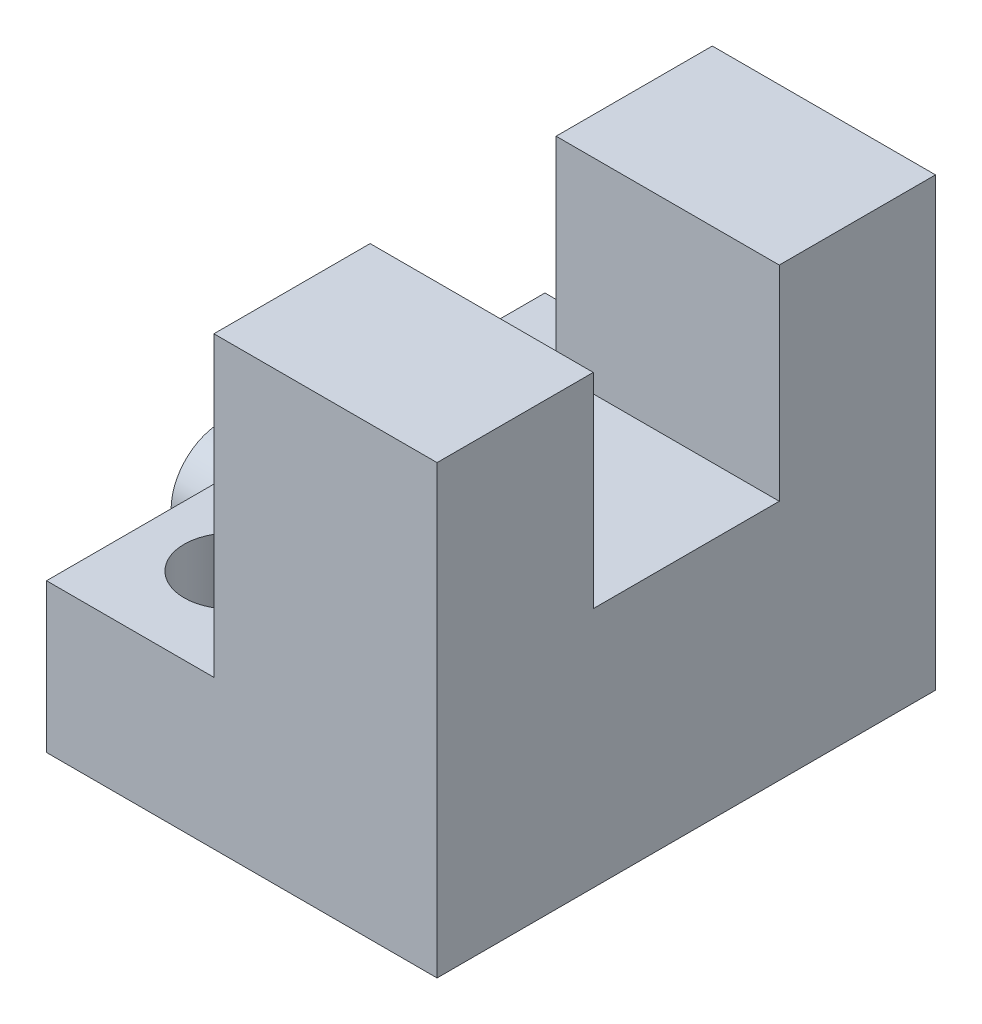
ISO-10303-21;
HEADER;
FILE_DESCRIPTION(('STEP AP214'),'2;1');
FILE_NAME('part.step','',(''),(''),'','','');
FILE_SCHEMA(('AUTOMOTIVE_DESIGN { 1 0 10303 214 1 1 1 1 }'));
ENDSEC;
DATA;
#1=APPLICATION_CONTEXT('core data for automotive mechanical design processes');
#2=APPLICATION_PROTOCOL_DEFINITION('international standard','automotive_design',2000,#1);
#3=PRODUCT_CONTEXT('',#1,'mechanical');
#4=PRODUCT('Part','Part','',(#3));
#5=PRODUCT_RELATED_PRODUCT_CATEGORY('part','',(#4));
#6=PRODUCT_DEFINITION_FORMATION('','',#4);
#7=PRODUCT_DEFINITION_CONTEXT('part definition',#1,'design');
#8=PRODUCT_DEFINITION('design','',#6,#7);
#9=PRODUCT_DEFINITION_SHAPE('','',#8);
#10=(LENGTH_UNIT() NAMED_UNIT(*) SI_UNIT(.MILLI.,.METRE.));
#11=(NAMED_UNIT(*) PLANE_ANGLE_UNIT() SI_UNIT($,.RADIAN.));
#12=(NAMED_UNIT(*) SI_UNIT($,.STERADIAN.) SOLID_ANGLE_UNIT());
#13=UNCERTAINTY_MEASURE_WITH_UNIT(LENGTH_MEASURE(1.E-05),#10,'distance_accuracy_value','');
#14=(GEOMETRIC_REPRESENTATION_CONTEXT(3) GLOBAL_UNCERTAINTY_ASSIGNED_CONTEXT((#13)) GLOBAL_UNIT_ASSIGNED_CONTEXT((#10,
#11,#12)) REPRESENTATION_CONTEXT('',''));
#15=CARTESIAN_POINT('',(0.,0.,0.));
#16=DIRECTION('',(0.,0.,1.));
#17=DIRECTION('',(1.,0.,0.));
#18=AXIS2_PLACEMENT_3D('',#15,#16,#17);
#19=CARTESIAN_POINT('',(4.5,12.,6.7));
#20=DIRECTION('',(0.,-1.,0.));
#21=DIRECTION('',(0.,0.,-1.));
#22=AXIS2_PLACEMENT_3D('',#19,#20,#21);
#23=PLANE('',#22);
#24=DIRECTION('',(0.,0.,-1.));
#25=VECTOR('',#24,1.);
#26=CARTESIAN_POINT('',(4.5,12.,6.7));
#27=LINE('',#26,#25);
#28=CARTESIAN_POINT('',(4.5,12.,-2.5));
#29=VERTEX_POINT('',#28);
#30=CARTESIAN_POINT('',(4.5,12.,-6.7));
#31=VERTEX_POINT('',#30);
#32=EDGE_CURVE('P0_E212',#29,#31,#27,.T.);
#33=ORIENTED_EDGE('',*,*,#32,.F.);
#34=DIRECTION('',(-1.,0.,0.));
#35=VECTOR('',#34,1.);
#36=CARTESIAN_POINT('',(10.5,12.,-2.5));
#37=LINE('',#36,#35);
#38=CARTESIAN_POINT('',(10.5,12.,-2.5));
#39=VERTEX_POINT('',#38);
#40=EDGE_CURVE('P0_E164',#39,#29,#37,.T.);
#41=ORIENTED_EDGE('',*,*,#40,.F.);
#42=DIRECTION('',(0.,0.,-1.));
#43=VECTOR('',#42,1.);
#44=CARTESIAN_POINT('',(10.5,12.,6.7));
#45=LINE('',#44,#43);
#46=CARTESIAN_POINT('',(10.5,12.,-6.7));
#47=VERTEX_POINT('',#46);
#48=EDGE_CURVE('P0_E216',#39,#47,#45,.T.);
#49=ORIENTED_EDGE('',*,*,#48,.T.);
#50=DIRECTION('',(-1.,0.,0.));
#51=VECTOR('',#50,1.);
#52=CARTESIAN_POINT('',(4.5,12.,-6.7));
#53=LINE('',#52,#51);
#54=EDGE_CURVE('P0_E196',#47,#31,#53,.T.);
#55=ORIENTED_EDGE('',*,*,#54,.T.);
#56=EDGE_LOOP('',(#33,#41,#49,#55));
#57=FACE_BOUND('',#56,.T.);
#58=ADVANCED_FACE('P0_F17',(#57),#23,.F.);
#59=CARTESIAN_POINT('',(0.,0.,6.7));
#60=DIRECTION('',(1.,0.,0.));
#61=DIRECTION('',(0.,0.,-1.));
#62=AXIS2_PLACEMENT_3D('',#59,#60,#61);
#63=PLANE('',#62);
#64=DIRECTION('',(0.,-1.,0.));
#65=VECTOR('',#64,1.);
#66=CARTESIAN_POINT('',(0.,0.,-6.7));
#67=LINE('',#66,#65);
#68=CARTESIAN_POINT('',(0.,4.,-6.7));
#69=VERTEX_POINT('',#68);
#70=CARTESIAN_POINT('',(0.,0.,-6.7));
#71=VERTEX_POINT('',#70);
#72=EDGE_CURVE('P0_E180',#69,#71,#67,.T.);
#73=ORIENTED_EDGE('',*,*,#72,.T.);
#74=DIRECTION('',(0.,0.,-1.));
#75=VECTOR('',#74,1.);
#76=CARTESIAN_POINT('',(0.,0.,6.7));
#77=LINE('',#76,#75);
#78=CARTESIAN_POINT('',(0.,0.,6.7));
#79=VERTEX_POINT('',#78);
#80=EDGE_CURVE('P0_E190',#79,#71,#77,.T.);
#81=ORIENTED_EDGE('',*,*,#80,.F.);
#82=DIRECTION('',(0.,-1.,0.));
#83=VECTOR('',#82,1.);
#84=CARTESIAN_POINT('',(0.,0.,6.7));
#85=LINE('',#84,#83);
#86=CARTESIAN_POINT('',(0.,4.,6.7));
#87=VERTEX_POINT('',#86);
#88=EDGE_CURVE('P0_E188',#87,#79,#85,.T.);
#89=ORIENTED_EDGE('',*,*,#88,.F.);
#90=DIRECTION('',(0.,0.,-1.));
#91=VECTOR('',#90,1.);
#92=CARTESIAN_POINT('',(0.,4.,6.7));
#93=LINE('',#92,#91);
#94=EDGE_CURVE('P0_E206',#87,#69,#93,.T.);
#95=ORIENTED_EDGE('',*,*,#94,.T.);
#96=EDGE_LOOP('',(#73,#81,#89,#95));
#97=FACE_BOUND('',#96,.T.);
#98=CARTESIAN_POINT('',(0.,2.,0.));
#99=DIRECTION('',(1.,0.,0.));
#100=DIRECTION('',(0.,0.,-1.));
#101=AXIS2_PLACEMENT_3D('',#98,#99,#100);
#102=CIRCLE('',#101,1.35);
#103=CARTESIAN_POINT('',(0.,2.,-1.35));
#104=VERTEX_POINT('',#103);
#105=EDGE_CURVE('P0_E11',#104,#104,#102,.F.);
#106=ORIENTED_EDGE('',*,*,#105,.F.);
#107=EDGE_LOOP('',(#106));
#108=FACE_BOUND('',#107,.T.);
#109=ADVANCED_FACE('P0_F255',(#97,#108),#63,.F.);
#110=CARTESIAN_POINT('',(10.5,0.,6.7));
#111=DIRECTION('',(0.,1.,0.));
#112=DIRECTION('',(0.,0.,1.));
#113=AXIS2_PLACEMENT_3D('',#110,#111,#112);
#114=PLANE('',#113);
#115=CARTESIAN_POINT('',(2.25,0.,4.));
#116=DIRECTION('',(0.,1.,0.));
#117=DIRECTION('',(0.,0.,1.));
#118=AXIS2_PLACEMENT_3D('',#115,#116,#117);
#119=CIRCLE('',#118,1.25);
#120=CARTESIAN_POINT('',(2.25,0.,5.25));
#121=VERTEX_POINT('',#120);
#122=EDGE_CURVE('P0_E141',#121,#121,#119,.T.);
#123=ORIENTED_EDGE('',*,*,#122,.T.);
#124=EDGE_LOOP('',(#123));
#125=FACE_BOUND('',#124,.T.);
#126=CARTESIAN_POINT('',(2.25,0.,-4.));
#127=DIRECTION('',(0.,1.,0.));
#128=DIRECTION('',(0.,0.,1.));
#129=AXIS2_PLACEMENT_3D('',#126,#127,#128);
#130=CIRCLE('',#129,1.25);
#131=CARTESIAN_POINT('',(2.25,0.,-2.75));
#132=VERTEX_POINT('',#131);
#133=EDGE_CURVE('P0_E147',#132,#132,#130,.T.);
#134=ORIENTED_EDGE('',*,*,#133,.T.);
#135=EDGE_LOOP('',(#134));
#136=FACE_BOUND('',#135,.T.);
#137=DIRECTION('',(1.,0.,0.));
#138=VECTOR('',#137,1.);
#139=CARTESIAN_POINT('',(10.5,0.,-6.7));
#140=LINE('',#139,#138);
#141=CARTESIAN_POINT('',(10.5,0.,-6.7));
#142=VERTEX_POINT('',#141);
#143=EDGE_CURVE('P0_E175',#71,#142,#140,.T.);
#144=ORIENTED_EDGE('',*,*,#143,.T.);
#145=DIRECTION('',(0.,0.,-1.));
#146=VECTOR('',#145,1.);
#147=CARTESIAN_POINT('',(10.5,0.,6.7));
#148=LINE('',#147,#146);
#149=CARTESIAN_POINT('',(10.5,0.,6.7));
#150=VERTEX_POINT('',#149);
#151=EDGE_CURVE('P0_E25',#150,#142,#148,.T.);
#152=ORIENTED_EDGE('',*,*,#151,.F.);
#153=DIRECTION('',(1.,0.,0.));
#154=VECTOR('',#153,1.);
#155=CARTESIAN_POINT('',(10.5,0.,6.7));
#156=LINE('',#155,#154);
#157=EDGE_CURVE('P0_E176',#79,#150,#156,.T.);
#158=ORIENTED_EDGE('',*,*,#157,.F.);
#159=ORIENTED_EDGE('',*,*,#80,.T.);
#160=EDGE_LOOP('',(#144,#152,#158,#159));
#161=FACE_BOUND('',#160,.T.);
#162=ADVANCED_FACE('P0_F19',(#125,#136,#161),#114,.F.);
#163=CARTESIAN_POINT('',(10.5,12.,6.7));
#164=DIRECTION('',(-1.,0.,0.));
#165=DIRECTION('',(0.,0.,1.));
#166=AXIS2_PLACEMENT_3D('',#163,#164,#165);
#167=PLANE('',#166);
#168=ORIENTED_EDGE('',*,*,#48,.F.);
#169=DIRECTION('',(0.,-1.,0.));
#170=VECTOR('',#169,1.);
#171=CARTESIAN_POINT('',(10.5,12.,-2.5));
#172=LINE('',#171,#170);
#173=CARTESIAN_POINT('',(10.5,6.5,-2.5));
#174=VERTEX_POINT('',#173);
#175=EDGE_CURVE('P0_E150',#39,#174,#172,.T.);
#176=ORIENTED_EDGE('',*,*,#175,.T.);
#177=DIRECTION('',(0.,0.,1.));
#178=VECTOR('',#177,1.);
#179=CARTESIAN_POINT('',(10.5,6.5,-2.5));
#180=LINE('',#179,#178);
#181=CARTESIAN_POINT('',(10.5,6.5,2.5));
#182=VERTEX_POINT('',#181);
#183=EDGE_CURVE('P0_E153',#174,#182,#180,.T.);
#184=ORIENTED_EDGE('',*,*,#183,.T.);
#185=DIRECTION('',(0.,1.,0.));
#186=VECTOR('',#185,1.);
#187=CARTESIAN_POINT('',(10.5,12.,2.5));
#188=LINE('',#187,#186);
#189=CARTESIAN_POINT('',(10.5,12.,2.5));
#190=VERTEX_POINT('',#189);
#191=EDGE_CURVE('P0_E157',#182,#190,#188,.T.);
#192=ORIENTED_EDGE('',*,*,#191,.T.);
#193=CARTESIAN_POINT('',(10.5,12.,6.7));
#194=VERTEX_POINT('',#193);
#195=EDGE_CURVE('P0_E217',#194,#190,#45,.T.);
#196=ORIENTED_EDGE('',*,*,#195,.F.);
#197=DIRECTION('',(0.,1.,0.));
#198=VECTOR('',#197,1.);
#199=CARTESIAN_POINT('',(10.5,12.,6.7));
#200=LINE('',#199,#198);
#201=EDGE_CURVE('P0_E179',#150,#194,#200,.T.);
#202=ORIENTED_EDGE('',*,*,#201,.F.);
#203=ORIENTED_EDGE('',*,*,#151,.T.);
#204=DIRECTION('',(0.,1.,0.));
#205=VECTOR('',#204,1.);
#206=CARTESIAN_POINT('',(10.5,12.,-6.7));
#207=LINE('',#206,#205);
#208=EDGE_CURVE('P0_E193',#142,#47,#207,.T.);
#209=ORIENTED_EDGE('',*,*,#208,.T.);
#210=EDGE_LOOP('',(#168,#176,#184,#192,#196,#202,#203,#209));
#211=FACE_BOUND('',#210,.T.);
#212=ADVANCED_FACE('P0_F223',(#211),#167,.F.);
#213=ORIENTED_EDGE('',*,*,#195,.T.);
#214=DIRECTION('',(-1.,0.,0.));
#215=VECTOR('',#214,1.);
#216=CARTESIAN_POINT('',(10.5,12.,2.5));
#217=LINE('',#216,#215);
#218=CARTESIAN_POINT('',(4.5,12.,2.5));
#219=VERTEX_POINT('',#218);
#220=EDGE_CURVE('P0_E167',#190,#219,#217,.T.);
#221=ORIENTED_EDGE('',*,*,#220,.T.);
#222=CARTESIAN_POINT('',(4.5,12.,6.7));
#223=VERTEX_POINT('',#222);
#224=EDGE_CURVE('P0_E213',#223,#219,#27,.T.);
#225=ORIENTED_EDGE('',*,*,#224,.F.);
#226=DIRECTION('',(-1.,0.,0.));
#227=VECTOR('',#226,1.);
#228=CARTESIAN_POINT('',(4.5,12.,6.7));
#229=LINE('',#228,#227);
#230=EDGE_CURVE('P0_E182',#194,#223,#229,.T.);
#231=ORIENTED_EDGE('',*,*,#230,.F.);
#232=EDGE_LOOP('',(#213,#221,#225,#231));
#233=FACE_BOUND('',#232,.T.);
#234=ADVANCED_FACE('P0_F245',(#233),#23,.F.);
#235=CARTESIAN_POINT('',(4.5,4.,6.7));
#236=DIRECTION('',(1.,0.,0.));
#237=DIRECTION('',(0.,0.,-1.));
#238=AXIS2_PLACEMENT_3D('',#235,#236,#237);
#239=PLANE('',#238);
#240=DIRECTION('',(0.,1.,0.));
#241=VECTOR('',#240,1.);
#242=CARTESIAN_POINT('',(4.5,12.,2.5));
#243=LINE('',#242,#241);
#244=CARTESIAN_POINT('',(4.5,5.5,2.5));
#245=VERTEX_POINT('',#244);
#246=EDGE_CURVE('P0_E154',#245,#219,#243,.T.);
#247=ORIENTED_EDGE('',*,*,#246,.F.);
#248=DIRECTION('',(0.,0.,1.));
#249=VECTOR('',#248,1.);
#250=CARTESIAN_POINT('',(4.5,5.5,2.5));
#251=LINE('',#250,#249);
#252=CARTESIAN_POINT('',(4.5,5.5,0.));
#253=VERTEX_POINT('',#252);
#254=EDGE_CURVE('P0_E264',#253,#245,#251,.T.);
#255=ORIENTED_EDGE('',*,*,#254,.F.);
#256=DIRECTION('',(0.,-1.,0.));
#257=VECTOR('',#256,1.);
#258=CARTESIAN_POINT('',(4.5,6.5,0.));
#259=LINE('',#258,#257);
#260=CARTESIAN_POINT('',(4.5,6.5,0.));
#261=VERTEX_POINT('',#260);
#262=EDGE_CURVE('P0_E262',#261,#253,#259,.T.);
#263=ORIENTED_EDGE('',*,*,#262,.F.);
#264=DIRECTION('',(0.,0.,1.));
#265=VECTOR('',#264,1.);
#266=CARTESIAN_POINT('',(4.5,6.5,-2.5));
#267=LINE('',#266,#265);
#268=CARTESIAN_POINT('',(4.5,6.5,-2.5));
#269=VERTEX_POINT('',#268);
#270=EDGE_CURVE('P0_E131',#269,#261,#267,.T.);
#271=ORIENTED_EDGE('',*,*,#270,.F.);
#272=DIRECTION('',(0.,-1.,0.));
#273=VECTOR('',#272,1.);
#274=CARTESIAN_POINT('',(4.5,12.,-2.5));
#275=LINE('',#274,#273);
#276=EDGE_CURVE('P0_E40',#29,#269,#275,.T.);
#277=ORIENTED_EDGE('',*,*,#276,.F.);
#278=ORIENTED_EDGE('',*,*,#32,.T.);
#279=DIRECTION('',(0.,-1.,0.));
#280=VECTOR('',#279,1.);
#281=CARTESIAN_POINT('',(4.5,4.,-6.7));
#282=LINE('',#281,#280);
#283=CARTESIAN_POINT('',(4.5,4.,-6.7));
#284=VERTEX_POINT('',#283);
#285=EDGE_CURVE('P0_E199',#31,#284,#282,.T.);
#286=ORIENTED_EDGE('',*,*,#285,.T.);
#287=DIRECTION('',(0.,0.,-1.));
#288=VECTOR('',#287,1.);
#289=CARTESIAN_POINT('',(4.5,4.,6.7));
#290=LINE('',#289,#288);
#291=CARTESIAN_POINT('',(4.5,4.,6.7));
#292=VERTEX_POINT('',#291);
#293=EDGE_CURVE('P0_E209',#292,#284,#290,.T.);
#294=ORIENTED_EDGE('',*,*,#293,.F.);
#295=DIRECTION('',(0.,-1.,0.));
#296=VECTOR('',#295,1.);
#297=CARTESIAN_POINT('',(4.5,4.,6.7));
#298=LINE('',#297,#296);
#299=EDGE_CURVE('P0_E184',#223,#292,#298,.T.);
#300=ORIENTED_EDGE('',*,*,#299,.F.);
#301=ORIENTED_EDGE('',*,*,#224,.T.);
#302=EDGE_LOOP('',(#247,#255,#263,#271,#277,#278,#286,#294,#300,#301));
#303=FACE_BOUND('',#302,.T.);
#304=ADVANCED_FACE('P0_F260',(#303),#239,.F.);
#305=CARTESIAN_POINT('',(0.,4.,6.7));
#306=DIRECTION('',(0.,-1.,0.));
#307=DIRECTION('',(0.,0.,-1.));
#308=AXIS2_PLACEMENT_3D('',#305,#306,#307);
#309=PLANE('',#308);
#310=CARTESIAN_POINT('',(2.25,4.,4.));
#311=DIRECTION('',(0.,1.,0.));
#312=DIRECTION('',(0.,0.,1.));
#313=AXIS2_PLACEMENT_3D('',#310,#311,#312);
#314=CIRCLE('',#313,1.24999999999999);
#315=CARTESIAN_POINT('',(2.25,4.,5.24999999999999));
#316=VERTEX_POINT('',#315);
#317=EDGE_CURVE('P0_E138',#316,#316,#314,.T.);
#318=ORIENTED_EDGE('',*,*,#317,.F.);
#319=EDGE_LOOP('',(#318));
#320=FACE_BOUND('',#319,.T.);
#321=CARTESIAN_POINT('',(2.25,4.,-4.));
#322=DIRECTION('',(0.,1.,0.));
#323=DIRECTION('',(0.,0.,1.));
#324=AXIS2_PLACEMENT_3D('',#321,#322,#323);
#325=CIRCLE('',#324,1.24999999999999);
#326=CARTESIAN_POINT('',(2.25,4.,-2.75000000000001));
#327=VERTEX_POINT('',#326);
#328=EDGE_CURVE('P0_E144',#327,#327,#325,.T.);
#329=ORIENTED_EDGE('',*,*,#328,.F.);
#330=EDGE_LOOP('',(#329));
#331=FACE_BOUND('',#330,.T.);
#332=DIRECTION('',(-1.,0.,0.));
#333=VECTOR('',#332,1.);
#334=CARTESIAN_POINT('',(0.,4.,-6.7));
#335=LINE('',#334,#333);
#336=EDGE_CURVE('P0_E201',#284,#69,#335,.T.);
#337=ORIENTED_EDGE('',*,*,#336,.T.);
#338=ORIENTED_EDGE('',*,*,#94,.F.);
#339=DIRECTION('',(-1.,0.,0.));
#340=VECTOR('',#339,1.);
#341=CARTESIAN_POINT('',(0.,4.,6.7));
#342=LINE('',#341,#340);
#343=EDGE_CURVE('P0_E186',#292,#87,#342,.T.);
#344=ORIENTED_EDGE('',*,*,#343,.F.);
#345=ORIENTED_EDGE('',*,*,#293,.T.);
#346=EDGE_LOOP('',(#337,#338,#344,#345));
#347=FACE_BOUND('',#346,.T.);
#348=ADVANCED_FACE('P0_F258',(#320,#331,#347),#309,.F.);
#349=CARTESIAN_POINT('',(0.,0.,6.7));
#350=DIRECTION('',(0.,0.,-1.));
#351=DIRECTION('',(-1.,0.,0.));
#352=AXIS2_PLACEMENT_3D('',#349,#350,#351);
#353=PLANE('',#352);
#354=ORIENTED_EDGE('',*,*,#157,.T.);
#355=ORIENTED_EDGE('',*,*,#201,.T.);
#356=ORIENTED_EDGE('',*,*,#230,.T.);
#357=ORIENTED_EDGE('',*,*,#299,.T.);
#358=ORIENTED_EDGE('',*,*,#343,.T.);
#359=ORIENTED_EDGE('',*,*,#88,.T.);
#360=EDGE_LOOP('',(#354,#355,#356,#357,#358,#359));
#361=FACE_BOUND('',#360,.T.);
#362=ADVANCED_FACE('P0_F249',(#361),#353,.F.);
#363=CARTESIAN_POINT('',(0.,0.,-6.7));
#364=DIRECTION('',(0.,0.,-1.));
#365=DIRECTION('',(-1.,0.,0.));
#366=AXIS2_PLACEMENT_3D('',#363,#364,#365);
#367=PLANE('',#366);
#368=ORIENTED_EDGE('',*,*,#143,.F.);
#369=ORIENTED_EDGE('',*,*,#72,.F.);
#370=ORIENTED_EDGE('',*,*,#336,.F.);
#371=ORIENTED_EDGE('',*,*,#285,.F.);
#372=ORIENTED_EDGE('',*,*,#54,.F.);
#373=ORIENTED_EDGE('',*,*,#208,.F.);
#374=EDGE_LOOP('',(#368,#369,#370,#371,#372,#373));
#375=FACE_BOUND('',#374,.T.);
#376=ADVANCED_FACE('P0_F232',(#375),#367,.T.);
#377=CARTESIAN_POINT('',(-2.,2.,0.));
#378=DIRECTION('',(1.,0.,0.));
#379=DIRECTION('',(0.,0.,-1.));
#380=AXIS2_PLACEMENT_3D('',#377,#378,#379);
#381=CYLINDRICAL_SURFACE('',#380,1.35);
#382=CARTESIAN_POINT('',(-2.,2.,0.));
#383=DIRECTION('',(-1.,0.,0.));
#384=DIRECTION('',(0.,0.,1.));
#385=AXIS2_PLACEMENT_3D('',#382,#383,#384);
#386=CIRCLE('',#385,1.35);
#387=CARTESIAN_POINT('',(-2.,2.,1.35));
#388=VERTEX_POINT('',#387);
#389=EDGE_CURVE('P0_E166',#388,#388,#386,.T.);
#390=ORIENTED_EDGE('',*,*,#389,.F.);
#391=EDGE_LOOP('',(#390));
#392=FACE_BOUND('',#391,.T.);
#393=ORIENTED_EDGE('',*,*,#105,.T.);
#394=EDGE_LOOP('',(#393));
#395=FACE_BOUND('',#394,.T.);
#396=ADVANCED_FACE('P0_F326',(#392,#395),#381,.T.);
#397=CARTESIAN_POINT('',(-2.,2.,0.));
#398=DIRECTION('',(-1.,0.,0.));
#399=DIRECTION('',(0.,0.,1.));
#400=AXIS2_PLACEMENT_3D('',#397,#398,#399);
#401=PLANE('',#400);
#402=ORIENTED_EDGE('',*,*,#389,.T.);
#403=EDGE_LOOP('',(#402));
#404=FACE_BOUND('',#403,.T.);
#405=ADVANCED_FACE('P0_F330',(#404),#401,.T.);
#406=CARTESIAN_POINT('',(10.5,12.,-2.5));
#407=DIRECTION('',(0.,0.,-1.));
#408=DIRECTION('',(0.,1.,0.));
#409=AXIS2_PLACEMENT_3D('',#406,#407,#408);
#410=PLANE('',#409);
#411=ORIENTED_EDGE('',*,*,#276,.T.);
#412=DIRECTION('',(-1.,0.,0.));
#413=VECTOR('',#412,1.);
#414=CARTESIAN_POINT('',(10.5,6.5,-2.5));
#415=LINE('',#414,#413);
#416=EDGE_CURVE('P0_E160',#174,#269,#415,.T.);
#417=ORIENTED_EDGE('',*,*,#416,.F.);
#418=ORIENTED_EDGE('',*,*,#175,.F.);
#419=ORIENTED_EDGE('',*,*,#40,.T.);
#420=EDGE_LOOP('',(#411,#417,#418,#419));
#421=FACE_BOUND('',#420,.T.);
#422=ADVANCED_FACE('P0_F239',(#421),#410,.F.);
#423=CARTESIAN_POINT('',(10.5,12.,2.5));
#424=DIRECTION('',(0.,0.,1.));
#425=DIRECTION('',(0.,-1.,0.));
#426=AXIS2_PLACEMENT_3D('',#423,#424,#425);
#427=PLANE('',#426);
#428=ORIENTED_EDGE('',*,*,#246,.T.);
#429=ORIENTED_EDGE('',*,*,#220,.F.);
#430=ORIENTED_EDGE('',*,*,#191,.F.);
#431=DIRECTION('',(-1.,0.,0.));
#432=VECTOR('',#431,1.);
#433=CARTESIAN_POINT('',(10.5,6.5,2.5));
#434=LINE('',#433,#432);
#435=CARTESIAN_POINT('',(5.,6.5,2.5));
#436=VERTEX_POINT('',#435);
#437=EDGE_CURVE('P0_E170',#182,#436,#434,.T.);
#438=ORIENTED_EDGE('',*,*,#437,.T.);
#439=DIRECTION('',(0.,1.,0.));
#440=VECTOR('',#439,1.);
#441=CARTESIAN_POINT('',(5.,6.5,2.5));
#442=LINE('',#441,#440);
#443=CARTESIAN_POINT('',(5.,5.5,2.5));
#444=VERTEX_POINT('',#443);
#445=EDGE_CURVE('P0_E32',#444,#436,#442,.T.);
#446=ORIENTED_EDGE('',*,*,#445,.F.);
#447=DIRECTION('',(-1.,0.,0.));
#448=VECTOR('',#447,1.);
#449=CARTESIAN_POINT('',(5.,5.5,2.5));
#450=LINE('',#449,#448);
#451=EDGE_CURVE('P0_E133',#444,#245,#450,.T.);
#452=ORIENTED_EDGE('',*,*,#451,.T.);
#453=EDGE_LOOP('',(#428,#429,#430,#438,#446,#452));
#454=FACE_BOUND('',#453,.T.);
#455=ADVANCED_FACE('P0_F242',(#454),#427,.F.);
#456=CARTESIAN_POINT('',(10.5,6.5,-2.5));
#457=DIRECTION('',(0.,-1.,0.));
#458=DIRECTION('',(0.,0.,-1.));
#459=AXIS2_PLACEMENT_3D('',#456,#457,#458);
#460=PLANE('',#459);
#461=ORIENTED_EDGE('',*,*,#270,.T.);
#462=DIRECTION('',(-1.,0.,0.));
#463=VECTOR('',#462,1.);
#464=CARTESIAN_POINT('',(5.,6.5,0.));
#465=LINE('',#464,#463);
#466=CARTESIAN_POINT('',(5.,6.5,0.));
#467=VERTEX_POINT('',#466);
#468=EDGE_CURVE('P0_E117',#467,#261,#465,.T.);
#469=ORIENTED_EDGE('',*,*,#468,.F.);
#470=DIRECTION('',(0.,0.,-1.));
#471=VECTOR('',#470,1.);
#472=CARTESIAN_POINT('',(5.,6.5,2.5));
#473=LINE('',#472,#471);
#474=EDGE_CURVE('P0_E122',#436,#467,#473,.T.);
#475=ORIENTED_EDGE('',*,*,#474,.F.);
#476=ORIENTED_EDGE('',*,*,#437,.F.);
#477=ORIENTED_EDGE('',*,*,#183,.F.);
#478=ORIENTED_EDGE('',*,*,#416,.T.);
#479=EDGE_LOOP('',(#461,#469,#475,#476,#477,#478));
#480=FACE_BOUND('',#479,.T.);
#481=ADVANCED_FACE('P0_F129',(#480),#460,.F.);
#482=CARTESIAN_POINT('',(2.25,4.,-4.));
#483=DIRECTION('',(0.,1.,0.));
#484=DIRECTION('',(0.,0.,1.));
#485=AXIS2_PLACEMENT_3D('',#482,#483,#484);
#486=CYLINDRICAL_SURFACE('',#485,1.25);
#487=ORIENTED_EDGE('',*,*,#133,.F.);
#488=EDGE_LOOP('',(#487));
#489=FACE_BOUND('',#488,.T.);
#490=ORIENTED_EDGE('',*,*,#328,.T.);
#491=EDGE_LOOP('',(#490));
#492=FACE_BOUND('',#491,.T.);
#493=ADVANCED_FACE('P0_F280',(#489,#492),#486,.F.);
#494=CARTESIAN_POINT('',(2.25,4.,4.));
#495=DIRECTION('',(0.,1.,0.));
#496=DIRECTION('',(0.,0.,1.));
#497=AXIS2_PLACEMENT_3D('',#494,#495,#496);
#498=CYLINDRICAL_SURFACE('',#497,1.25);
#499=ORIENTED_EDGE('',*,*,#122,.F.);
#500=EDGE_LOOP('',(#499));
#501=FACE_BOUND('',#500,.T.);
#502=ORIENTED_EDGE('',*,*,#317,.T.);
#503=EDGE_LOOP('',(#502));
#504=FACE_BOUND('',#503,.T.);
#505=ADVANCED_FACE('P0_F271',(#501,#504),#498,.F.);
#506=CARTESIAN_POINT('',(5.,5.5,2.5));
#507=DIRECTION('',(0.,-1.,0.));
#508=DIRECTION('',(0.,0.,-1.));
#509=AXIS2_PLACEMENT_3D('',#506,#507,#508);
#510=PLANE('',#509);
#511=ORIENTED_EDGE('',*,*,#254,.T.);
#512=ORIENTED_EDGE('',*,*,#451,.F.);
#513=DIRECTION('',(0.,0.,1.));
#514=VECTOR('',#513,1.);
#515=CARTESIAN_POINT('',(5.,5.5,2.5));
#516=LINE('',#515,#514);
#517=CARTESIAN_POINT('',(5.,5.5,0.));
#518=VERTEX_POINT('',#517);
#519=EDGE_CURVE('P0_E121',#518,#444,#516,.T.);
#520=ORIENTED_EDGE('',*,*,#519,.F.);
#521=DIRECTION('',(-1.,0.,0.));
#522=VECTOR('',#521,1.);
#523=CARTESIAN_POINT('',(5.,5.5,0.));
#524=LINE('',#523,#522);
#525=EDGE_CURVE('P0_E119',#518,#253,#524,.T.);
#526=ORIENTED_EDGE('',*,*,#525,.T.);
#527=EDGE_LOOP('',(#511,#512,#520,#526));
#528=FACE_BOUND('',#527,.T.);
#529=ADVANCED_FACE('P0_F269',(#528),#510,.F.);
#530=CARTESIAN_POINT('',(5.,6.5,0.));
#531=DIRECTION('',(0.,0.,-1.));
#532=DIRECTION('',(0.,1.,0.));
#533=AXIS2_PLACEMENT_3D('',#530,#531,#532);
#534=PLANE('',#533);
#535=ORIENTED_EDGE('',*,*,#262,.T.);
#536=ORIENTED_EDGE('',*,*,#525,.F.);
#537=DIRECTION('',(0.,-1.,0.));
#538=VECTOR('',#537,1.);
#539=CARTESIAN_POINT('',(5.,6.5,0.));
#540=LINE('',#539,#538);
#541=EDGE_CURVE('P0_E113',#467,#518,#540,.T.);
#542=ORIENTED_EDGE('',*,*,#541,.F.);
#543=ORIENTED_EDGE('',*,*,#468,.T.);
#544=EDGE_LOOP('',(#535,#536,#542,#543));
#545=FACE_BOUND('',#544,.T.);
#546=ADVANCED_FACE('P0_F115',(#545),#534,.F.);
#547=CARTESIAN_POINT('',(5.,5.5,2.5));
#548=DIRECTION('',(1.,0.,0.));
#549=DIRECTION('',(0.,0.,-1.));
#550=AXIS2_PLACEMENT_3D('',#547,#548,#549);
#551=PLANE('',#550);
#552=ORIENTED_EDGE('',*,*,#445,.T.);
#553=ORIENTED_EDGE('',*,*,#474,.T.);
#554=ORIENTED_EDGE('',*,*,#541,.T.);
#555=ORIENTED_EDGE('',*,*,#519,.T.);
#556=EDGE_LOOP('',(#552,#553,#554,#555));
#557=FACE_BOUND('',#556,.T.);
#558=ADVANCED_FACE('P0_F124',(#557),#551,.F.);
#559=CLOSED_SHELL('',(#58,#109,#162,#212,#234,#304,#348,#362,#376,#396,#405,#422,#455,#481,#493,
#505,#529,#546,#558));
#560=MANIFOLD_SOLID_BREP('P0_B1',#559);
#561=CARTESIAN_POINT('',(5.,5.5,2.5));
#562=DIRECTION('',(-1.,0.,0.));
#563=DIRECTION('',(0.,0.,1.));
#564=AXIS2_PLACEMENT_3D('',#561,#562,#563);
#565=PLANE('',#564);
#566=DIRECTION('',(0.,0.,1.));
#567=VECTOR('',#566,1.);
#568=CARTESIAN_POINT('',(5.,5.5,0.));
#569=LINE('',#568,#567);
#570=CARTESIAN_POINT('',(5.,5.5,0.));
#571=VERTEX_POINT('',#570);
#572=CARTESIAN_POINT('',(5.,5.5,2.5));
#573=VERTEX_POINT('',#572);
#574=EDGE_CURVE('P1_E66',#571,#573,#569,.T.);
#575=ORIENTED_EDGE('',*,*,#574,.F.);
#576=DIRECTION('',(0.,-1.,0.));
#577=VECTOR('',#576,1.);
#578=CARTESIAN_POINT('',(5.,6.5,0.));
#579=LINE('',#578,#577);
#580=CARTESIAN_POINT('',(5.,6.5,0.));
#581=VERTEX_POINT('',#580);
#582=EDGE_CURVE('P1_E77',#581,#571,#579,.T.);
#583=ORIENTED_EDGE('',*,*,#582,.F.);
#584=DIRECTION('',(0.,0.,-1.));
#585=VECTOR('',#584,1.);
#586=CARTESIAN_POINT('',(5.,6.5,2.5));
#587=LINE('',#586,#585);
#588=CARTESIAN_POINT('',(5.,6.5,2.5));
#589=VERTEX_POINT('',#588);
#590=EDGE_CURVE('P1_E68',#589,#581,#587,.T.);
#591=ORIENTED_EDGE('',*,*,#590,.F.);
#592=DIRECTION('',(0.,1.,0.));
#593=VECTOR('',#592,1.);
#594=CARTESIAN_POINT('',(5.,5.5,2.5));
#595=LINE('',#594,#593);
#596=EDGE_CURVE('P1_E58',#573,#589,#595,.T.);
#597=ORIENTED_EDGE('',*,*,#596,.F.);
#598=EDGE_LOOP('',(#575,#583,#591,#597));
#599=FACE_BOUND('',#598,.T.);
#600=ADVANCED_FACE('P1_F17',(#599),#565,.F.);
#601=CARTESIAN_POINT('',(1.80741759643275,6.5,0.));
#602=DIRECTION('',(0.,0.,1.));
#603=DIRECTION('',(0.,-1.,0.));
#604=AXIS2_PLACEMENT_3D('',#601,#602,#603);
#605=PLANE('',#604);
#606=DIRECTION('',(1.,0.,0.));
#607=VECTOR('',#606,1.);
#608=CARTESIAN_POINT('',(1.80741759643275,5.5,0.));
#609=LINE('',#608,#607);
#610=CARTESIAN_POINT('',(4.5,5.5,0.));
#611=VERTEX_POINT('',#610);
#612=EDGE_CURVE('P1_E71',#611,#571,#609,.T.);
#613=ORIENTED_EDGE('',*,*,#612,.F.);
#614=DIRECTION('',(0.,1.,0.));
#615=VECTOR('',#614,1.);
#616=CARTESIAN_POINT('',(4.5,6.5,0.));
#617=LINE('',#616,#615);
#618=CARTESIAN_POINT('',(4.5,6.5,0.));
#619=VERTEX_POINT('',#618);
#620=EDGE_CURVE('P1_E21',#611,#619,#617,.T.);
#621=ORIENTED_EDGE('',*,*,#620,.T.);
#622=DIRECTION('',(1.,0.,0.));
#623=VECTOR('',#622,1.);
#624=CARTESIAN_POINT('',(1.80741759643275,6.5,0.));
#625=LINE('',#624,#623);
#626=EDGE_CURVE('P1_E80',#619,#581,#625,.T.);
#627=ORIENTED_EDGE('',*,*,#626,.T.);
#628=ORIENTED_EDGE('',*,*,#582,.T.);
#629=EDGE_LOOP('',(#613,#621,#627,#628));
#630=FACE_BOUND('',#629,.T.);
#631=ADVANCED_FACE('P1_F90',(#630),#605,.F.);
#632=CARTESIAN_POINT('',(1.80741759643275,6.5,2.5));
#633=DIRECTION('',(0.,-1.,0.));
#634=DIRECTION('',(0.,0.,-1.));
#635=AXIS2_PLACEMENT_3D('',#632,#633,#634);
#636=PLANE('',#635);
#637=ORIENTED_EDGE('',*,*,#626,.F.);
#638=DIRECTION('',(0.,0.,1.));
#639=VECTOR('',#638,1.);
#640=CARTESIAN_POINT('',(4.5,6.5,2.5));
#641=LINE('',#640,#639);
#642=CARTESIAN_POINT('',(4.5,6.5,2.5));
#643=VERTEX_POINT('',#642);
#644=EDGE_CURVE('P1_E86',#619,#643,#641,.T.);
#645=ORIENTED_EDGE('',*,*,#644,.T.);
#646=DIRECTION('',(1.,0.,0.));
#647=VECTOR('',#646,1.);
#648=CARTESIAN_POINT('',(1.80741759643275,6.5,2.5));
#649=LINE('',#648,#647);
#650=EDGE_CURVE('P1_E62',#643,#589,#649,.T.);
#651=ORIENTED_EDGE('',*,*,#650,.T.);
#652=ORIENTED_EDGE('',*,*,#590,.T.);
#653=EDGE_LOOP('',(#637,#645,#651,#652));
#654=FACE_BOUND('',#653,.T.);
#655=ADVANCED_FACE('P1_F85',(#654),#636,.F.);
#656=CARTESIAN_POINT('',(1.80741759643275,5.5,2.5));
#657=DIRECTION('',(0.,0.,-1.));
#658=DIRECTION('',(-1.,0.,0.));
#659=AXIS2_PLACEMENT_3D('',#656,#657,#658);
#660=PLANE('',#659);
#661=ORIENTED_EDGE('',*,*,#650,.F.);
#662=DIRECTION('',(0.,-1.,0.));
#663=VECTOR('',#662,1.);
#664=CARTESIAN_POINT('',(4.5,5.5,2.5));
#665=LINE('',#664,#663);
#666=CARTESIAN_POINT('',(4.5,5.5,2.5));
#667=VERTEX_POINT('',#666);
#668=EDGE_CURVE('P1_E26',#643,#667,#665,.T.);
#669=ORIENTED_EDGE('',*,*,#668,.T.);
#670=DIRECTION('',(1.,0.,0.));
#671=VECTOR('',#670,1.);
#672=CARTESIAN_POINT('',(1.80741759643275,5.5,2.5));
#673=LINE('',#672,#671);
#674=EDGE_CURVE('P1_E55',#667,#573,#673,.T.);
#675=ORIENTED_EDGE('',*,*,#674,.T.);
#676=ORIENTED_EDGE('',*,*,#596,.T.);
#677=EDGE_LOOP('',(#661,#669,#675,#676));
#678=FACE_BOUND('',#677,.T.);
#679=ADVANCED_FACE('P1_F57',(#678),#660,.F.);
#680=CARTESIAN_POINT('',(1.80741759643275,5.5,0.));
#681=DIRECTION('',(0.,1.,0.));
#682=DIRECTION('',(0.,0.,1.));
#683=AXIS2_PLACEMENT_3D('',#680,#681,#682);
#684=PLANE('',#683);
#685=ORIENTED_EDGE('',*,*,#674,.F.);
#686=DIRECTION('',(0.,0.,-1.));
#687=VECTOR('',#686,1.);
#688=CARTESIAN_POINT('',(4.5,5.5,0.));
#689=LINE('',#688,#687);
#690=EDGE_CURVE('P1_E11',#667,#611,#689,.T.);
#691=ORIENTED_EDGE('',*,*,#690,.T.);
#692=ORIENTED_EDGE('',*,*,#612,.T.);
#693=ORIENTED_EDGE('',*,*,#574,.T.);
#694=EDGE_LOOP('',(#685,#691,#692,#693));
#695=FACE_BOUND('',#694,.T.);
#696=ADVANCED_FACE('P1_F19',(#695),#684,.F.);
#697=CARTESIAN_POINT('',(4.5,4.,6.7));
#698=DIRECTION('',(1.,0.,0.));
#699=DIRECTION('',(0.,0.,-1.));
#700=AXIS2_PLACEMENT_3D('',#697,#698,#699);
#701=PLANE('',#700);
#702=ORIENTED_EDGE('',*,*,#668,.F.);
#703=ORIENTED_EDGE('',*,*,#644,.F.);
#704=ORIENTED_EDGE('',*,*,#620,.F.);
#705=ORIENTED_EDGE('',*,*,#690,.F.);
#706=EDGE_LOOP('',(#702,#703,#704,#705));
#707=FACE_BOUND('',#706,.T.);
#708=ADVANCED_FACE('P1_F91',(#707),#701,.F.);
#709=CLOSED_SHELL('',(#600,#631,#655,#679,#696,#708));
#710=MANIFOLD_SOLID_BREP('P1_B1',#709);
#711=ADVANCED_BREP_SHAPE_REPRESENTATION('',(#18,#560,#710),#14);
#712=SHAPE_DEFINITION_REPRESENTATION(#9,#711);
ENDSEC;
END-ISO-10303-21;
